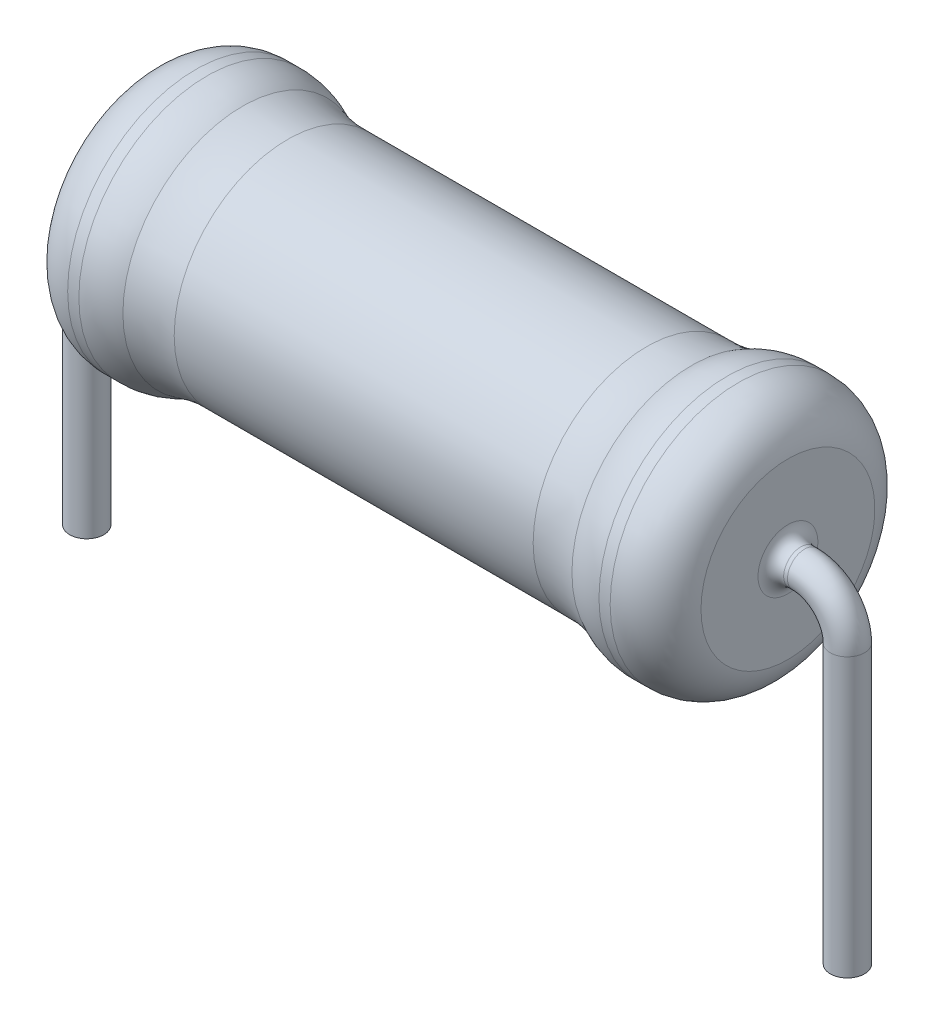
ISO-10303-21;
HEADER;
FILE_DESCRIPTION(('STEP AP214'),'2;1');
FILE_NAME('part.step','',(''),(''),'','','');
FILE_SCHEMA(('AUTOMOTIVE_DESIGN { 1 0 10303 214 1 1 1 1 }'));
ENDSEC;
DATA;
#1=APPLICATION_CONTEXT('core data for automotive mechanical design processes');
#2=APPLICATION_PROTOCOL_DEFINITION('international standard','automotive_design',2000,#1);
#3=PRODUCT_CONTEXT('',#1,'mechanical');
#4=PRODUCT('Part','Part','',(#3));
#5=PRODUCT_RELATED_PRODUCT_CATEGORY('part','',(#4));
#6=PRODUCT_DEFINITION_FORMATION('','',#4);
#7=PRODUCT_DEFINITION_CONTEXT('part definition',#1,'design');
#8=PRODUCT_DEFINITION('design','',#6,#7);
#9=PRODUCT_DEFINITION_SHAPE('','',#8);
#10=(LENGTH_UNIT() NAMED_UNIT(*) SI_UNIT(.MILLI.,.METRE.));
#11=(NAMED_UNIT(*) PLANE_ANGLE_UNIT() SI_UNIT($,.RADIAN.));
#12=(NAMED_UNIT(*) SI_UNIT($,.STERADIAN.) SOLID_ANGLE_UNIT());
#13=UNCERTAINTY_MEASURE_WITH_UNIT(LENGTH_MEASURE(1.E-05),#10,'distance_accuracy_value','');
#14=(GEOMETRIC_REPRESENTATION_CONTEXT(3) GLOBAL_UNCERTAINTY_ASSIGNED_CONTEXT((#13)) GLOBAL_UNIT_ASSIGNED_CONTEXT((#10,
#11,#12)) REPRESENTATION_CONTEXT('',''));
#15=CARTESIAN_POINT('',(0.,0.,0.));
#16=DIRECTION('',(0.,0.,1.));
#17=DIRECTION('',(1.,0.,0.));
#18=AXIS2_PLACEMENT_3D('',#15,#16,#17);
#19=CARTESIAN_POINT('',(8.89,5.3,0.));
#20=DIRECTION('',(0.,-1.,0.));
#21=DIRECTION('',(0.,0.,-1.));
#22=AXIS2_PLACEMENT_3D('',#19,#20,#21);
#23=CYLINDRICAL_SURFACE('',#22,0.4);
#24=CARTESIAN_POINT('',(8.89,0.,0.));
#25=DIRECTION('',(0.,1.,0.));
#26=DIRECTION('',(0.,0.,-1.));
#27=AXIS2_PLACEMENT_3D('',#24,#25,#26);
#28=CIRCLE('',#27,0.4);
#29=CARTESIAN_POINT('',(8.89,0.,-0.399999999999997));
#30=VERTEX_POINT('',#29);
#31=EDGE_CURVE('E64',#30,#30,#28,.T.);
#32=ORIENTED_EDGE('',*,*,#31,.T.);
#33=EDGE_LOOP('',(#32));
#34=FACE_BOUND('',#33,.T.);
#35=CARTESIAN_POINT('',(8.89,6.5,0.));
#36=DIRECTION('',(0.,1.,0.));
#37=DIRECTION('',(0.,0.,1.));
#38=AXIS2_PLACEMENT_3D('',#35,#36,#37);
#39=CIRCLE('',#38,0.4);
#40=CARTESIAN_POINT('',(9.29,6.5,0.));
#41=VERTEX_POINT('',#40);
#42=EDGE_CURVE('E72',#41,#41,#39,.T.);
#43=ORIENTED_EDGE('',*,*,#42,.F.);
#44=EDGE_LOOP('',(#43));
#45=FACE_BOUND('',#44,.T.);
#46=ADVANCED_FACE('F38',(#34,#45),#23,.T.);
#47=CARTESIAN_POINT('',(8.89,0.,0.));
#48=DIRECTION('',(0.,-1.,0.));
#49=DIRECTION('',(0.,0.,-1.));
#50=AXIS2_PLACEMENT_3D('',#47,#48,#49);
#51=PLANE('',#50);
#52=ORIENTED_EDGE('',*,*,#31,.F.);
#53=EDGE_LOOP('',(#52));
#54=FACE_BOUND('',#53,.T.);
#55=ADVANCED_FACE('F146',(#54),#51,.T.);
#56=CARTESIAN_POINT('',(7.88999999999999,7.50000000000001,0.));
#57=DIRECTION('',(-1.,0.,0.));
#58=DIRECTION('',(0.,-1.,0.));
#59=AXIS2_PLACEMENT_3D('',#56,#57,#58);
#60=CYLINDRICAL_SURFACE('',#59,0.4);
#61=CARTESIAN_POINT('',(7.8,7.50000000000001,0.));
#62=DIRECTION('',(1.,0.,0.));
#63=DIRECTION('',(0.,0.,-1.));
#64=AXIS2_PLACEMENT_3D('',#61,#62,#63);
#65=CIRCLE('',#64,0.4);
#66=CARTESIAN_POINT('',(7.8,7.50000000000001,-0.399999999999997));
#67=VERTEX_POINT('',#66);
#68=EDGE_CURVE('E53',#67,#67,#65,.T.);
#69=ORIENTED_EDGE('',*,*,#68,.T.);
#70=EDGE_LOOP('',(#69));
#71=FACE_BOUND('',#70,.T.);
#72=CARTESIAN_POINT('',(7.88999999999999,7.50000000000001,0.));
#73=DIRECTION('',(-1.,0.,0.));
#74=DIRECTION('',(0.,0.,1.));
#75=AXIS2_PLACEMENT_3D('',#72,#73,#74);
#76=CIRCLE('',#75,0.4);
#77=CARTESIAN_POINT('',(7.88999999999999,7.9,0.));
#78=VERTEX_POINT('',#77);
#79=EDGE_CURVE('E68',#78,#78,#76,.T.);
#80=ORIENTED_EDGE('',*,*,#79,.T.);
#81=EDGE_LOOP('',(#80));
#82=FACE_BOUND('',#81,.T.);
#83=ADVANCED_FACE('F152',(#71,#82),#60,.T.);
#84=CARTESIAN_POINT('',(7.89,6.5,0.));
#85=DIRECTION('',(0.,0.,1.));
#86=DIRECTION('',(1.,0.,0.));
#87=AXIS2_PLACEMENT_3D('',#84,#85,#86);
#88=TOROIDAL_SURFACE('',#87,1.,0.4);
#89=CARTESIAN_POINT('',(7.89,6.5,0.));
#90=DIRECTION('',(0.,0.,1.));
#91=DIRECTION('',(1.,0.,0.));
#92=AXIS2_PLACEMENT_3D('',#89,#90,#91);
#93=CIRCLE('',#92,1.4);
#94=EDGE_CURVE('',#41,#78,#93,.T.);
#95=ORIENTED_EDGE('',*,*,#42,.T.);
#96=ORIENTED_EDGE('',*,*,#79,.F.);
#97=ORIENTED_EDGE('',*,*,#94,.T.);
#98=ORIENTED_EDGE('',*,*,#94,.F.);
#99=EDGE_LOOP('',(#95,#97,#96,#98));
#100=FACE_BOUND('',#99,.T.);
#101=ADVANCED_FACE('F218',(#100),#88,.T.);
#102=CARTESIAN_POINT('',(-7.5,7.5,0.));
#103=DIRECTION('',(-1.,0.,0.));
#104=DIRECTION('',(0.,0.,1.));
#105=AXIS2_PLACEMENT_3D('',#102,#103,#104);
#106=CYLINDRICAL_SURFACE('',#105,2.99594040391513);
#107=CARTESIAN_POINT('',(6.34035764376127,7.5,0.));
#108=DIRECTION('',(-1.,0.,0.));
#109=DIRECTION('',(0.,0.,1.));
#110=AXIS2_PLACEMENT_3D('',#107,#108,#109);
#111=CIRCLE('',#110,2.99594040391513);
#112=CARTESIAN_POINT('',(6.34035764376127,7.5,2.99594040391513));
#113=VERTEX_POINT('',#112);
#114=EDGE_CURVE('E110',#113,#113,#111,.T.);
#115=ORIENTED_EDGE('',*,*,#114,.T.);
#116=EDGE_LOOP('',(#115));
#117=FACE_BOUND('',#116,.T.);
#118=CARTESIAN_POINT('',(6.07878029462323,7.5,0.));
#119=DIRECTION('',(-1.,0.,0.));
#120=DIRECTION('',(0.,0.,1.));
#121=AXIS2_PLACEMENT_3D('',#118,#119,#120);
#122=CIRCLE('',#121,2.99594040391513);
#123=CARTESIAN_POINT('',(6.07878029462323,7.5,2.99594040391513));
#124=VERTEX_POINT('',#123);
#125=EDGE_CURVE('E76',#124,#124,#122,.T.);
#126=ORIENTED_EDGE('',*,*,#125,.F.);
#127=EDGE_LOOP('',(#126));
#128=FACE_BOUND('',#127,.T.);
#129=ADVANCED_FACE('F214',(#117,#128),#106,.T.);
#130=CARTESIAN_POINT('',(6.01148186066371,7.5,0.));
#131=DIRECTION('',(-1.,0.,0.));
#132=DIRECTION('',(0.,0.,1.));
#133=AXIS2_PLACEMENT_3D('',#130,#131,#132);
#134=DEGENERATE_TOROIDAL_SURFACE('',#133,1.44056539793985,1.55683026962671,.T.);
#135=CARTESIAN_POINT('',(5.24777611599688,7.5,0.));
#136=DIRECTION('',(-1.,0.,0.));
#137=DIRECTION('',(0.,0.,1.));
#138=AXIS2_PLACEMENT_3D('',#135,#136,#137);
#139=CIRCLE('',#138,2.79720611087341);
#140=CARTESIAN_POINT('',(5.24777611599688,7.5,2.79720611087341));
#141=VERTEX_POINT('',#140);
#142=EDGE_CURVE('E80',#141,#141,#139,.T.);
#143=ORIENTED_EDGE('',*,*,#142,.F.);
#144=EDGE_LOOP('',(#143));
#145=FACE_BOUND('',#144,.T.);
#146=ORIENTED_EDGE('',*,*,#125,.T.);
#147=EDGE_LOOP('',(#146));
#148=FACE_BOUND('',#147,.T.);
#149=ADVANCED_FACE('F210',(#145,#148),#134,.T.);
#150=CARTESIAN_POINT('',(4.32631253481364,7.5,0.));
#151=DIRECTION('',(-1.,0.,0.));
#152=DIRECTION('',(0.,0.,1.));
#153=AXIS2_PLACEMENT_3D('',#150,#151,#152);
#154=TOROIDAL_SURFACE('',#153,5.56543813213998,2.91756810631948);
#155=CARTESIAN_POINT('',(4.19527223034759,7.5,0.));
#156=DIRECTION('',(-1.,0.,0.));
#157=DIRECTION('',(0.,0.,1.));
#158=AXIS2_PLACEMENT_3D('',#155,#156,#157);
#159=CIRCLE('',#158,2.65081429815761);
#160=CARTESIAN_POINT('',(4.19527223034759,7.5,2.65081429815761));
#161=VERTEX_POINT('',#160);
#162=EDGE_CURVE('E84',#161,#161,#159,.T.);
#163=ORIENTED_EDGE('',*,*,#162,.F.);
#164=EDGE_LOOP('',(#163));
#165=FACE_BOUND('',#164,.T.);
#166=ORIENTED_EDGE('',*,*,#142,.T.);
#167=EDGE_LOOP('',(#166));
#168=FACE_BOUND('',#167,.T.);
#169=ADVANCED_FACE('F206',(#165,#168),#154,.F.);
#170=CARTESIAN_POINT('',(-7.5,7.5,0.));
#171=DIRECTION('',(-1.,0.,0.));
#172=DIRECTION('',(0.,0.,1.));
#173=AXIS2_PLACEMENT_3D('',#170,#171,#172);
#174=CYLINDRICAL_SURFACE('',#173,2.65081429815761);
#175=ORIENTED_EDGE('',*,*,#162,.T.);
#176=EDGE_LOOP('',(#175));
#177=FACE_BOUND('',#176,.T.);
#178=CARTESIAN_POINT('',(-4.19527223034759,7.5,0.));
#179=DIRECTION('',(-1.,0.,0.));
#180=DIRECTION('',(0.,0.,1.));
#181=AXIS2_PLACEMENT_3D('',#178,#179,#180);
#182=CIRCLE('',#181,2.65081429815761);
#183=CARTESIAN_POINT('',(-4.19527223034759,7.5,2.65081429815761));
#184=VERTEX_POINT('',#183);
#185=EDGE_CURVE('E88',#184,#184,#182,.T.);
#186=ORIENTED_EDGE('',*,*,#185,.F.);
#187=EDGE_LOOP('',(#186));
#188=FACE_BOUND('',#187,.T.);
#189=ADVANCED_FACE('F202',(#177,#188),#174,.T.);
#190=CARTESIAN_POINT('',(-4.32631253481364,7.5,0.));
#191=DIRECTION('',(-1.,0.,0.));
#192=DIRECTION('',(0.,0.,1.));
#193=AXIS2_PLACEMENT_3D('',#190,#191,#192);
#194=TOROIDAL_SURFACE('',#193,5.56543813213998,2.91756810631948);
#195=ORIENTED_EDGE('',*,*,#185,.T.);
#196=EDGE_LOOP('',(#195));
#197=FACE_BOUND('',#196,.T.);
#198=CARTESIAN_POINT('',(-5.24777611599688,7.5,0.));
#199=DIRECTION('',(-1.,0.,0.));
#200=DIRECTION('',(0.,0.,1.));
#201=AXIS2_PLACEMENT_3D('',#198,#199,#200);
#202=CIRCLE('',#201,2.79720611087341);
#203=CARTESIAN_POINT('',(-5.24777611599688,7.5,2.79720611087341));
#204=VERTEX_POINT('',#203);
#205=EDGE_CURVE('E91',#204,#204,#202,.T.);
#206=ORIENTED_EDGE('',*,*,#205,.F.);
#207=EDGE_LOOP('',(#206));
#208=FACE_BOUND('',#207,.T.);
#209=ADVANCED_FACE('F198',(#197,#208),#194,.F.);
#210=CARTESIAN_POINT('',(-6.01148186066371,7.5,0.));
#211=DIRECTION('',(-1.,0.,0.));
#212=DIRECTION('',(0.,0.,1.));
#213=AXIS2_PLACEMENT_3D('',#210,#211,#212);
#214=DEGENERATE_TOROIDAL_SURFACE('',#213,1.44056539793985,1.55683026962671,.T.);
#215=ORIENTED_EDGE('',*,*,#205,.T.);
#216=EDGE_LOOP('',(#215));
#217=FACE_BOUND('',#216,.T.);
#218=CARTESIAN_POINT('',(-6.07878029462323,7.5,0.));
#219=DIRECTION('',(-1.,0.,0.));
#220=DIRECTION('',(0.,0.,1.));
#221=AXIS2_PLACEMENT_3D('',#218,#219,#220);
#222=CIRCLE('',#221,2.99594040391513);
#223=CARTESIAN_POINT('',(-6.07878029462323,7.5,2.99594040391513));
#224=VERTEX_POINT('',#223);
#225=EDGE_CURVE('E95',#224,#224,#222,.T.);
#226=ORIENTED_EDGE('',*,*,#225,.F.);
#227=EDGE_LOOP('',(#226));
#228=FACE_BOUND('',#227,.T.);
#229=ADVANCED_FACE('F194',(#217,#228),#214,.T.);
#230=CARTESIAN_POINT('',(-7.5,7.5,0.));
#231=DIRECTION('',(-1.,0.,0.));
#232=DIRECTION('',(0.,0.,1.));
#233=AXIS2_PLACEMENT_3D('',#230,#231,#232);
#234=CYLINDRICAL_SURFACE('',#233,2.99594040391513);
#235=CARTESIAN_POINT('',(-6.34035764376127,7.5,0.));
#236=DIRECTION('',(-1.,0.,0.));
#237=DIRECTION('',(0.,0.,1.));
#238=AXIS2_PLACEMENT_3D('',#235,#236,#237);
#239=CIRCLE('',#238,2.99594040391513);
#240=CARTESIAN_POINT('',(-6.34035764376127,7.5,2.99594040391513));
#241=VERTEX_POINT('',#240);
#242=EDGE_CURVE('E98',#241,#241,#239,.T.);
#243=ORIENTED_EDGE('',*,*,#242,.F.);
#244=EDGE_LOOP('',(#243));
#245=FACE_BOUND('',#244,.T.);
#246=ORIENTED_EDGE('',*,*,#225,.T.);
#247=EDGE_LOOP('',(#246));
#248=FACE_BOUND('',#247,.T.);
#249=ADVANCED_FACE('F190',(#245,#248),#234,.T.);
#250=CARTESIAN_POINT('',(-6.33663498253437,7.5,0.));
#251=DIRECTION('',(-1.,0.,0.));
#252=DIRECTION('',(0.,0.,1.));
#253=AXIS2_PLACEMENT_3D('',#250,#251,#252);
#254=TOROIDAL_SURFACE('',#253,1.8118897115427,1.18405654439062);
#255=ORIENTED_EDGE('',*,*,#242,.T.);
#256=EDGE_LOOP('',(#255));
#257=FACE_BOUND('',#256,.T.);
#258=CARTESIAN_POINT('',(-7.5,7.5,0.));
#259=DIRECTION('',(-1.,0.,0.));
#260=DIRECTION('',(0.,0.,1.));
#261=AXIS2_PLACEMENT_3D('',#258,#259,#260);
#262=CIRCLE('',#261,2.03227967604072);
#263=CARTESIAN_POINT('',(-7.5,7.5,2.03227967604072));
#264=VERTEX_POINT('',#263);
#265=EDGE_CURVE('E102',#264,#264,#262,.T.);
#266=ORIENTED_EDGE('',*,*,#265,.F.);
#267=EDGE_LOOP('',(#266));
#268=FACE_BOUND('',#267,.T.);
#269=ADVANCED_FACE('F187',(#257,#268),#254,.T.);
#270=CARTESIAN_POINT('',(-7.5,0.,0.));
#271=DIRECTION('',(-1.,0.,0.));
#272=DIRECTION('',(0.,0.,1.));
#273=AXIS2_PLACEMENT_3D('',#270,#271,#272);
#274=PLANE('',#273);
#275=CARTESIAN_POINT('',(-7.5,7.50000000000001,0.));
#276=DIRECTION('',(-1.,0.,0.));
#277=DIRECTION('',(0.,0.,1.));
#278=AXIS2_PLACEMENT_3D('',#275,#276,#277);
#279=CIRCLE('',#278,0.699999999999999);
#280=CARTESIAN_POINT('',(-7.5,7.50000000000001,0.700000000000002));
#281=VERTEX_POINT('',#280);
#282=EDGE_CURVE('E10',#281,#281,#279,.F.);
#283=ORIENTED_EDGE('',*,*,#282,.T.);
#284=EDGE_LOOP('',(#283));
#285=FACE_BOUND('',#284,.T.);
#286=ORIENTED_EDGE('',*,*,#265,.T.);
#287=EDGE_LOOP('',(#286));
#288=FACE_BOUND('',#287,.T.);
#289=ADVANCED_FACE('F171',(#285,#288),#274,.T.);
#290=CARTESIAN_POINT('',(7.5,0.,0.));
#291=DIRECTION('',(1.,0.,0.));
#292=DIRECTION('',(0.,0.,-1.));
#293=AXIS2_PLACEMENT_3D('',#290,#291,#292);
#294=PLANE('',#293);
#295=CARTESIAN_POINT('',(7.5,7.50000000000001,0.));
#296=DIRECTION('',(1.,0.,0.));
#297=DIRECTION('',(0.,0.,-1.));
#298=AXIS2_PLACEMENT_3D('',#295,#296,#297);
#299=CIRCLE('',#298,0.699999999999999);
#300=CARTESIAN_POINT('',(7.5,7.50000000000001,-0.699999999999997));
#301=VERTEX_POINT('',#300);
#302=EDGE_CURVE('E58',#301,#301,#299,.F.);
#303=ORIENTED_EDGE('',*,*,#302,.T.);
#304=EDGE_LOOP('',(#303));
#305=FACE_BOUND('',#304,.T.);
#306=CARTESIAN_POINT('',(7.5,7.5,0.));
#307=DIRECTION('',(-1.,0.,0.));
#308=DIRECTION('',(0.,0.,1.));
#309=AXIS2_PLACEMENT_3D('',#306,#307,#308);
#310=CIRCLE('',#309,2.03227967604072);
#311=CARTESIAN_POINT('',(7.5,7.5,2.03227967604072));
#312=VERTEX_POINT('',#311);
#313=EDGE_CURVE('E106',#312,#312,#310,.T.);
#314=ORIENTED_EDGE('',*,*,#313,.F.);
#315=EDGE_LOOP('',(#314));
#316=FACE_BOUND('',#315,.T.);
#317=ADVANCED_FACE('F167',(#305,#316),#294,.T.);
#318=CARTESIAN_POINT('',(6.33663498253437,7.5,0.));
#319=DIRECTION('',(-1.,0.,0.));
#320=DIRECTION('',(0.,0.,1.));
#321=AXIS2_PLACEMENT_3D('',#318,#319,#320);
#322=TOROIDAL_SURFACE('',#321,1.8118897115427,1.18405654439062);
#323=ORIENTED_EDGE('',*,*,#114,.F.);
#324=EDGE_LOOP('',(#323));
#325=FACE_BOUND('',#324,.T.);
#326=ORIENTED_EDGE('',*,*,#313,.T.);
#327=EDGE_LOOP('',(#326));
#328=FACE_BOUND('',#327,.T.);
#329=ADVANCED_FACE('F170',(#325,#328),#322,.T.);
#330=CARTESIAN_POINT('',(-8.89,0.,0.));
#331=DIRECTION('',(0.,-1.,0.));
#332=DIRECTION('',(0.,0.,-1.));
#333=AXIS2_PLACEMENT_3D('',#330,#331,#332);
#334=PLANE('',#333);
#335=CARTESIAN_POINT('',(-8.89,0.,0.));
#336=DIRECTION('',(0.,-1.,0.));
#337=DIRECTION('',(0.,0.,-1.));
#338=AXIS2_PLACEMENT_3D('',#335,#336,#337);
#339=CIRCLE('',#338,0.4);
#340=CARTESIAN_POINT('',(-8.89,0.,-0.399999999999997));
#341=VERTEX_POINT('',#340);
#342=EDGE_CURVE('E114',#341,#341,#339,.T.);
#343=ORIENTED_EDGE('',*,*,#342,.T.);
#344=EDGE_LOOP('',(#343));
#345=FACE_BOUND('',#344,.T.);
#346=ADVANCED_FACE('F142',(#345),#334,.T.);
#347=CARTESIAN_POINT('',(-8.89,5.3,0.));
#348=DIRECTION('',(0.,-1.,0.));
#349=DIRECTION('',(0.,0.,-1.));
#350=AXIS2_PLACEMENT_3D('',#347,#348,#349);
#351=CYLINDRICAL_SURFACE('',#350,0.4);
#352=ORIENTED_EDGE('',*,*,#342,.F.);
#353=EDGE_LOOP('',(#352));
#354=FACE_BOUND('',#353,.T.);
#355=CARTESIAN_POINT('',(-8.89,6.5,0.));
#356=DIRECTION('',(0.,-1.,0.));
#357=DIRECTION('',(0.,0.,1.));
#358=AXIS2_PLACEMENT_3D('',#355,#356,#357);
#359=CIRCLE('',#358,0.4);
#360=CARTESIAN_POINT('',(-9.29,6.5,0.));
#361=VERTEX_POINT('',#360);
#362=EDGE_CURVE('E122',#361,#361,#359,.T.);
#363=ORIENTED_EDGE('',*,*,#362,.T.);
#364=EDGE_LOOP('',(#363));
#365=FACE_BOUND('',#364,.T.);
#366=ADVANCED_FACE('F127',(#354,#365),#351,.T.);
#367=CARTESIAN_POINT('',(-7.88999999999999,7.50000000000001,0.));
#368=DIRECTION('',(1.,0.,0.));
#369=DIRECTION('',(0.,-1.,0.));
#370=AXIS2_PLACEMENT_3D('',#367,#368,#369);
#371=CYLINDRICAL_SURFACE('',#370,0.4);
#372=CARTESIAN_POINT('',(-7.8,7.50000000000001,0.));
#373=DIRECTION('',(-1.,0.,0.));
#374=DIRECTION('',(0.,0.,1.));
#375=AXIS2_PLACEMENT_3D('',#372,#373,#374);
#376=CIRCLE('',#375,0.4);
#377=CARTESIAN_POINT('',(-7.8,7.50000000000001,0.400000000000002));
#378=VERTEX_POINT('',#377);
#379=EDGE_CURVE('E46',#378,#378,#376,.T.);
#380=ORIENTED_EDGE('',*,*,#379,.T.);
#381=EDGE_LOOP('',(#380));
#382=FACE_BOUND('',#381,.T.);
#383=CARTESIAN_POINT('',(-7.88999999999999,7.50000000000001,0.));
#384=DIRECTION('',(-1.,0.,0.));
#385=DIRECTION('',(0.,0.,1.));
#386=AXIS2_PLACEMENT_3D('',#383,#384,#385);
#387=CIRCLE('',#386,0.4);
#388=CARTESIAN_POINT('',(-7.88999999999999,7.9,0.));
#389=VERTEX_POINT('',#388);
#390=EDGE_CURVE('E118',#389,#389,#387,.T.);
#391=ORIENTED_EDGE('',*,*,#390,.F.);
#392=EDGE_LOOP('',(#391));
#393=FACE_BOUND('',#392,.T.);
#394=ADVANCED_FACE('F133',(#382,#393),#371,.T.);
#395=CARTESIAN_POINT('',(-7.89,6.5,0.));
#396=DIRECTION('',(0.,0.,1.));
#397=DIRECTION('',(-1.,0.,0.));
#398=AXIS2_PLACEMENT_3D('',#395,#396,#397);
#399=TOROIDAL_SURFACE('',#398,1.,0.4);
#400=CARTESIAN_POINT('',(-7.89,6.5,0.));
#401=DIRECTION('',(0.,0.,1.));
#402=DIRECTION('',(-1.,0.,0.));
#403=AXIS2_PLACEMENT_3D('',#400,#401,#402);
#404=CIRCLE('',#403,1.4);
#405=EDGE_CURVE('',#389,#361,#404,.T.);
#406=ORIENTED_EDGE('',*,*,#390,.T.);
#407=ORIENTED_EDGE('',*,*,#362,.F.);
#408=ORIENTED_EDGE('',*,*,#405,.T.);
#409=ORIENTED_EDGE('',*,*,#405,.F.);
#410=EDGE_LOOP('',(#406,#408,#407,#409));
#411=FACE_BOUND('',#410,.T.);
#412=ADVANCED_FACE('F129',(#411),#399,.T.);
#413=CARTESIAN_POINT('',(7.8,7.50000000000001,0.));
#414=DIRECTION('',(1.,0.,0.));
#415=DIRECTION('',(0.,0.,-1.));
#416=AXIS2_PLACEMENT_3D('',#413,#414,#415);
#417=TOROIDAL_SURFACE('',#416,0.699999999999999,0.3);
#418=ORIENTED_EDGE('',*,*,#68,.F.);
#419=EDGE_LOOP('',(#418));
#420=FACE_BOUND('',#419,.T.);
#421=ORIENTED_EDGE('',*,*,#302,.F.);
#422=EDGE_LOOP('',(#421));
#423=FACE_BOUND('',#422,.T.);
#424=ADVANCED_FACE('F132',(#420,#423),#417,.F.);
#425=CARTESIAN_POINT('',(-7.8,7.50000000000001,0.));
#426=DIRECTION('',(-1.,0.,0.));
#427=DIRECTION('',(0.,0.,1.));
#428=AXIS2_PLACEMENT_3D('',#425,#426,#427);
#429=TOROIDAL_SURFACE('',#428,0.699999999999999,0.3);
#430=ORIENTED_EDGE('',*,*,#282,.F.);
#431=EDGE_LOOP('',(#430));
#432=FACE_BOUND('',#431,.T.);
#433=ORIENTED_EDGE('',*,*,#379,.F.);
#434=EDGE_LOOP('',(#433));
#435=FACE_BOUND('',#434,.T.);
#436=ADVANCED_FACE('F40',(#432,#435),#429,.F.);
#437=CLOSED_SHELL('',(#46,#55,#83,#101,#129,#149,#169,#189,#209,#229,#249,#269,#289,#317,#329,
#346,#366,#394,#412,#424,#436));
#438=MANIFOLD_SOLID_BREP('B2',#437);
#439=ADVANCED_BREP_SHAPE_REPRESENTATION('',(#18,#438),#14);
#440=SHAPE_DEFINITION_REPRESENTATION(#9,#439);
ENDSEC;
END-ISO-10303-21;
